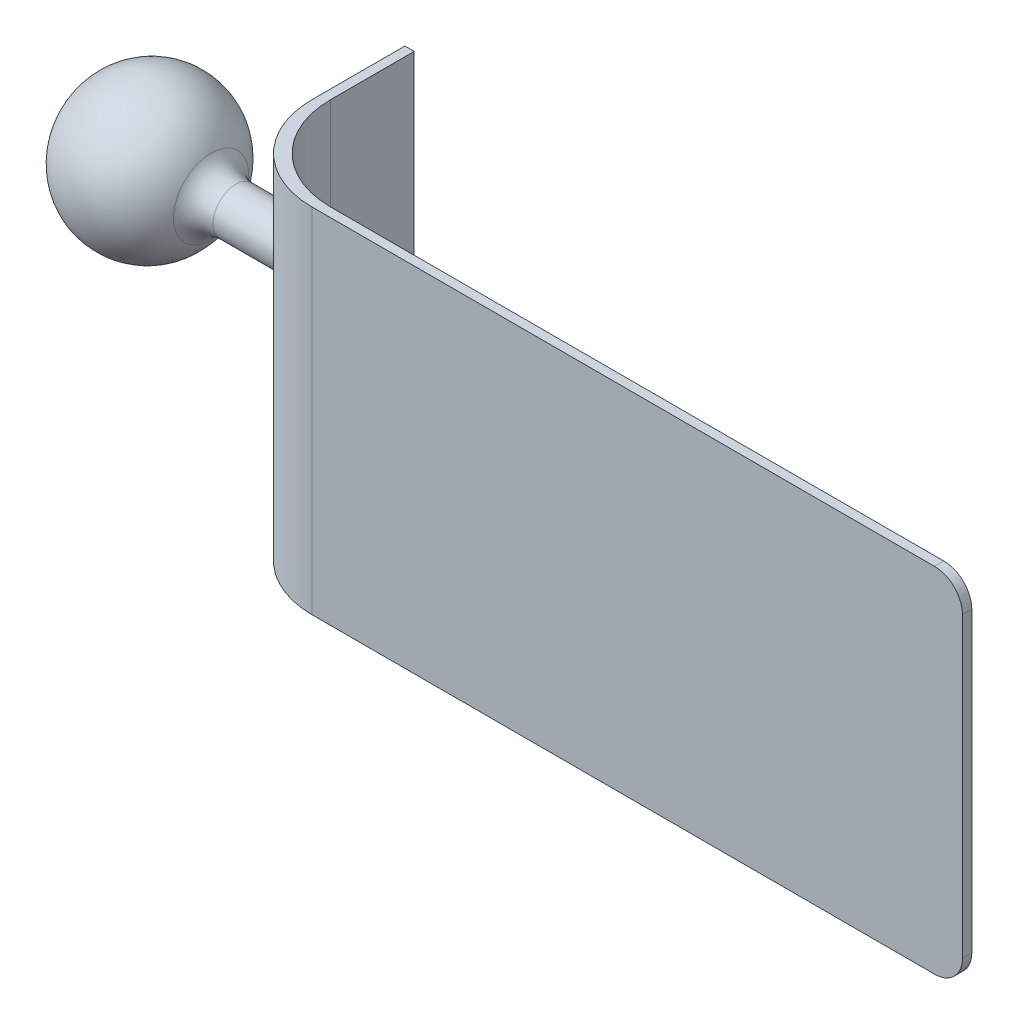
ISO-10303-21;
HEADER;
FILE_DESCRIPTION(('STEP AP214'),'2;1');
FILE_NAME('part.step','',(''),(''),'','','');
FILE_SCHEMA(('AUTOMOTIVE_DESIGN { 1 0 10303 214 1 1 1 1 }'));
ENDSEC;
DATA;
#1=APPLICATION_CONTEXT('core data for automotive mechanical design processes');
#2=APPLICATION_PROTOCOL_DEFINITION('international standard','automotive_design',2000,#1);
#3=PRODUCT_CONTEXT('',#1,'mechanical');
#4=PRODUCT('Part','Part','',(#3));
#5=PRODUCT_RELATED_PRODUCT_CATEGORY('part','',(#4));
#6=PRODUCT_DEFINITION_FORMATION('','',#4);
#7=PRODUCT_DEFINITION_CONTEXT('part definition',#1,'design');
#8=PRODUCT_DEFINITION('design','',#6,#7);
#9=PRODUCT_DEFINITION_SHAPE('','',#8);
#10=(LENGTH_UNIT() NAMED_UNIT(*) SI_UNIT(.MILLI.,.METRE.));
#11=(NAMED_UNIT(*) PLANE_ANGLE_UNIT() SI_UNIT($,.RADIAN.));
#12=(NAMED_UNIT(*) SI_UNIT($,.STERADIAN.) SOLID_ANGLE_UNIT());
#13=UNCERTAINTY_MEASURE_WITH_UNIT(LENGTH_MEASURE(1.E-05),#10,'distance_accuracy_value','');
#14=(GEOMETRIC_REPRESENTATION_CONTEXT(3) GLOBAL_UNCERTAINTY_ASSIGNED_CONTEXT((#13)) GLOBAL_UNIT_ASSIGNED_CONTEXT((#10,
#11,#12)) REPRESENTATION_CONTEXT('',''));
#15=CARTESIAN_POINT('',(0.,0.,0.));
#16=DIRECTION('',(0.,0.,1.));
#17=DIRECTION('',(1.,0.,0.));
#18=AXIS2_PLACEMENT_3D('',#15,#16,#17);
#19=CARTESIAN_POINT('',(-0.999999999999997,19.,20.));
#20=DIRECTION('',(1.,0.,0.));
#21=DIRECTION('',(0.,0.,-1.));
#22=AXIS2_PLACEMENT_3D('',#19,#20,#21);
#23=PLANE('',#22);
#24=DIRECTION('',(0.,-1.,0.));
#25=VECTOR('',#24,1.);
#26=CARTESIAN_POINT('',(-0.999999999999998,19.,10.));
#27=LINE('',#26,#25);
#28=CARTESIAN_POINT('',(-0.999999999999998,-19.,10.));
#29=VERTEX_POINT('',#28);
#30=CARTESIAN_POINT('',(-0.999999999999998,-3.01628226172121,10.));
#31=VERTEX_POINT('',#30);
#32=EDGE_CURVE('E281',#29,#31,#27,.F.);
#33=ORIENTED_EDGE('',*,*,#32,.T.);
#34=CARTESIAN_POINT('',(-0.999999999999999,0.,5.4548979341187));
#35=DIRECTION('',(1.,0.,0.));
#36=DIRECTION('',(0.,0.,-1.));
#37=AXIS2_PLACEMENT_3D('',#34,#35,#36);
#38=CIRCLE('',#37,5.4548979341187);
#39=CARTESIAN_POINT('',(-1.,0.,0.));
#40=VERTEX_POINT('',#39);
#41=EDGE_CURVE('E11',#31,#40,#38,.T.);
#42=ORIENTED_EDGE('',*,*,#41,.T.);
#43=DIRECTION('',(0.,-1.,0.));
#44=VECTOR('',#43,1.);
#45=CARTESIAN_POINT('',(-1.,19.,0.));
#46=LINE('',#45,#44);
#47=CARTESIAN_POINT('',(-1.,-19.,0.));
#48=VERTEX_POINT('',#47);
#49=EDGE_CURVE('E185',#40,#48,#46,.T.);
#50=ORIENTED_EDGE('',*,*,#49,.T.);
#51=DIRECTION('',(0.,0.,1.));
#52=VECTOR('',#51,1.);
#53=CARTESIAN_POINT('',(-0.999999999999997,-19.,20.));
#54=LINE('',#53,#52);
#55=EDGE_CURVE('E216',#48,#29,#54,.T.);
#56=ORIENTED_EDGE('',*,*,#55,.T.);
#57=EDGE_LOOP('',(#33,#42,#50,#56));
#58=FACE_BOUND('',#57,.T.);
#59=ADVANCED_FACE('F40',(#58),#23,.F.);
#60=CARTESIAN_POINT('',(-1.,19.,0.));
#61=DIRECTION('',(0.,0.,1.));
#62=DIRECTION('',(1.,0.,0.));
#63=AXIS2_PLACEMENT_3D('',#60,#61,#62);
#64=PLANE('',#63);
#65=DIRECTION('',(-1.,0.,0.));
#66=VECTOR('',#65,1.);
#67=CARTESIAN_POINT('',(-1.,-19.,0.));
#68=LINE('',#67,#66);
#69=CARTESIAN_POINT('',(0.,-19.,0.));
#70=VERTEX_POINT('',#69);
#71=EDGE_CURVE('E211',#70,#48,#68,.T.);
#72=ORIENTED_EDGE('',*,*,#71,.T.);
#73=ORIENTED_EDGE('',*,*,#49,.F.);
#74=CARTESIAN_POINT('',(-1.,19.,0.));
#75=VERTEX_POINT('',#74);
#76=EDGE_CURVE('E178',#75,#40,#46,.T.);
#77=ORIENTED_EDGE('',*,*,#76,.F.);
#78=DIRECTION('',(-1.,0.,0.));
#79=VECTOR('',#78,1.);
#80=CARTESIAN_POINT('',(-1.,19.,0.));
#81=LINE('',#80,#79);
#82=CARTESIAN_POINT('',(0.,19.,0.));
#83=VERTEX_POINT('',#82);
#84=EDGE_CURVE('E237',#83,#75,#81,.T.);
#85=ORIENTED_EDGE('',*,*,#84,.F.);
#86=DIRECTION('',(0.,-1.,0.));
#87=VECTOR('',#86,1.);
#88=CARTESIAN_POINT('',(0.,19.,0.));
#89=LINE('',#88,#87);
#90=EDGE_CURVE('E238',#83,#70,#89,.T.);
#91=ORIENTED_EDGE('',*,*,#90,.T.);
#92=EDGE_LOOP('',(#72,#73,#77,#85,#91));
#93=FACE_BOUND('',#92,.T.);
#94=ADVANCED_FACE('F159',(#93),#64,.F.);
#95=ORIENTED_EDGE('',*,*,#76,.T.);
#96=CARTESIAN_POINT('',(-0.999999999999999,0.,5.4548979341187));
#97=DIRECTION('',(1.,0.,0.));
#98=DIRECTION('',(0.,0.,-1.));
#99=AXIS2_PLACEMENT_3D('',#96,#97,#98);
#100=CIRCLE('',#99,5.4548979341187);
#101=CARTESIAN_POINT('',(-0.999999999999998,3.01628226172121,10.));
#102=VERTEX_POINT('',#101);
#103=EDGE_CURVE('E55',#40,#102,#100,.T.);
#104=ORIENTED_EDGE('',*,*,#103,.T.);
#105=CARTESIAN_POINT('',(-0.999999999999998,19.,10.));
#106=VERTEX_POINT('',#105);
#107=EDGE_CURVE('E280',#102,#106,#27,.F.);
#108=ORIENTED_EDGE('',*,*,#107,.T.);
#109=DIRECTION('',(0.,0.,1.));
#110=VECTOR('',#109,1.);
#111=CARTESIAN_POINT('',(-0.999999999999997,19.,20.));
#112=LINE('',#111,#110);
#113=EDGE_CURVE('E180',#75,#106,#112,.T.);
#114=ORIENTED_EDGE('',*,*,#113,.F.);
#115=EDGE_LOOP('',(#95,#104,#108,#114));
#116=FACE_BOUND('',#115,.T.);
#117=ADVANCED_FACE('F161',(#116),#23,.F.);
#118=CARTESIAN_POINT('',(79.,19.,20.));
#119=DIRECTION('',(0.,0.,-1.));
#120=DIRECTION('',(-1.,0.,0.));
#121=AXIS2_PLACEMENT_3D('',#118,#119,#120);
#122=PLANE('',#121);
#123=DIRECTION('',(1.,0.,0.));
#124=VECTOR('',#123,1.);
#125=CARTESIAN_POINT('',(79.,19.,20.));
#126=LINE('',#125,#124);
#127=CARTESIAN_POINT('',(9.00000000000001,19.,20.));
#128=VERTEX_POINT('',#127);
#129=CARTESIAN_POINT('',(76.,19.,20.));
#130=VERTEX_POINT('',#129);
#131=EDGE_CURVE('E351',#128,#130,#126,.T.);
#132=ORIENTED_EDGE('',*,*,#131,.F.);
#133=DIRECTION('',(0.,-1.,0.));
#134=VECTOR('',#133,1.);
#135=CARTESIAN_POINT('',(9.00000000000001,19.,20.));
#136=LINE('',#135,#134);
#137=CARTESIAN_POINT('',(9.00000000000001,-19.,20.));
#138=VERTEX_POINT('',#137);
#139=EDGE_CURVE('E276',#128,#138,#136,.T.);
#140=ORIENTED_EDGE('',*,*,#139,.T.);
#141=DIRECTION('',(1.,0.,0.));
#142=VECTOR('',#141,1.);
#143=CARTESIAN_POINT('',(79.,-19.,20.));
#144=LINE('',#143,#142);
#145=CARTESIAN_POINT('',(76.,-19.,20.));
#146=VERTEX_POINT('',#145);
#147=EDGE_CURVE('E222',#138,#146,#144,.T.);
#148=ORIENTED_EDGE('',*,*,#147,.T.);
#149=CARTESIAN_POINT('',(76.,-16.,20.));
#150=DIRECTION('',(0.,0.,-1.));
#151=DIRECTION('',(-1.,0.,0.));
#152=AXIS2_PLACEMENT_3D('',#149,#150,#151);
#153=CIRCLE('',#152,3.);
#154=CARTESIAN_POINT('',(79.,-16.,20.));
#155=VERTEX_POINT('',#154);
#156=EDGE_CURVE('E269',#146,#155,#153,.F.);
#157=ORIENTED_EDGE('',*,*,#156,.T.);
#158=DIRECTION('',(0.,-1.,0.));
#159=VECTOR('',#158,1.);
#160=CARTESIAN_POINT('',(79.,19.,20.));
#161=LINE('',#160,#159);
#162=CARTESIAN_POINT('',(79.,16.,20.));
#163=VERTEX_POINT('',#162);
#164=EDGE_CURVE('E245',#163,#155,#161,.T.);
#165=ORIENTED_EDGE('',*,*,#164,.F.);
#166=CARTESIAN_POINT('',(76.,16.,20.));
#167=DIRECTION('',(0.,0.,-1.));
#168=DIRECTION('',(-1.,0.,0.));
#169=AXIS2_PLACEMENT_3D('',#166,#167,#168);
#170=CIRCLE('',#169,3.);
#171=EDGE_CURVE('E265',#163,#130,#170,.F.);
#172=ORIENTED_EDGE('',*,*,#171,.T.);
#173=EDGE_LOOP('',(#132,#140,#148,#157,#165,#172));
#174=FACE_BOUND('',#173,.T.);
#175=ADVANCED_FACE('F170',(#174),#122,.F.);
#176=CARTESIAN_POINT('',(79.,19.,19.));
#177=DIRECTION('',(-1.,0.,0.));
#178=DIRECTION('',(0.,0.,1.));
#179=AXIS2_PLACEMENT_3D('',#176,#177,#178);
#180=PLANE('',#179);
#181=ORIENTED_EDGE('',*,*,#164,.T.);
#182=DIRECTION('',(0.,0.,-1.));
#183=VECTOR('',#182,1.);
#184=CARTESIAN_POINT('',(79.,-16.,19.));
#185=LINE('',#184,#183);
#186=CARTESIAN_POINT('',(79.,-16.,19.));
#187=VERTEX_POINT('',#186);
#188=EDGE_CURVE('E251',#155,#187,#185,.T.);
#189=ORIENTED_EDGE('',*,*,#188,.T.);
#190=DIRECTION('',(0.,-1.,0.));
#191=VECTOR('',#190,1.);
#192=CARTESIAN_POINT('',(79.,19.,19.));
#193=LINE('',#192,#191);
#194=CARTESIAN_POINT('',(79.,16.,19.));
#195=VERTEX_POINT('',#194);
#196=EDGE_CURVE('E241',#195,#187,#193,.T.);
#197=ORIENTED_EDGE('',*,*,#196,.F.);
#198=DIRECTION('',(0.,0.,-1.));
#199=VECTOR('',#198,1.);
#200=CARTESIAN_POINT('',(79.,16.,19.));
#201=LINE('',#200,#199);
#202=EDGE_CURVE('E184',#195,#163,#201,.F.);
#203=ORIENTED_EDGE('',*,*,#202,.T.);
#204=EDGE_LOOP('',(#181,#189,#197,#203));
#205=FACE_BOUND('',#204,.T.);
#206=ADVANCED_FACE('F175',(#205),#180,.F.);
#207=CARTESIAN_POINT('',(0.,19.,19.));
#208=DIRECTION('',(0.,0.,1.));
#209=DIRECTION('',(1.,0.,0.));
#210=AXIS2_PLACEMENT_3D('',#207,#208,#209);
#211=PLANE('',#210);
#212=DIRECTION('',(-1.,0.,0.));
#213=VECTOR('',#212,1.);
#214=CARTESIAN_POINT('',(0.,-19.,19.));
#215=LINE('',#214,#213);
#216=CARTESIAN_POINT('',(76.,-19.,19.));
#217=VERTEX_POINT('',#216);
#218=CARTESIAN_POINT('',(10.,-19.,19.));
#219=VERTEX_POINT('',#218);
#220=EDGE_CURVE('E230',#217,#219,#215,.T.);
#221=ORIENTED_EDGE('',*,*,#220,.T.);
#222=DIRECTION('',(0.,-1.,0.));
#223=VECTOR('',#222,1.);
#224=CARTESIAN_POINT('',(10.,19.,19.));
#225=LINE('',#224,#223);
#226=CARTESIAN_POINT('',(10.,19.,19.));
#227=VERTEX_POINT('',#226);
#228=EDGE_CURVE('E288',#219,#227,#225,.F.);
#229=ORIENTED_EDGE('',*,*,#228,.T.);
#230=DIRECTION('',(-1.,0.,0.));
#231=VECTOR('',#230,1.);
#232=CARTESIAN_POINT('',(0.,19.,19.));
#233=LINE('',#232,#231);
#234=CARTESIAN_POINT('',(76.,19.,19.));
#235=VERTEX_POINT('',#234);
#236=EDGE_CURVE('E345',#235,#227,#233,.T.);
#237=ORIENTED_EDGE('',*,*,#236,.F.);
#238=CARTESIAN_POINT('',(76.,16.,19.));
#239=DIRECTION('',(0.,0.,1.));
#240=DIRECTION('',(1.,0.,0.));
#241=AXIS2_PLACEMENT_3D('',#238,#239,#240);
#242=CIRCLE('',#241,3.);
#243=EDGE_CURVE('E255',#235,#195,#242,.F.);
#244=ORIENTED_EDGE('',*,*,#243,.T.);
#245=ORIENTED_EDGE('',*,*,#196,.T.);
#246=CARTESIAN_POINT('',(76.,-16.,19.));
#247=DIRECTION('',(0.,0.,1.));
#248=DIRECTION('',(1.,0.,0.));
#249=AXIS2_PLACEMENT_3D('',#246,#247,#248);
#250=CIRCLE('',#249,3.);
#251=EDGE_CURVE('E258',#187,#217,#250,.F.);
#252=ORIENTED_EDGE('',*,*,#251,.T.);
#253=EDGE_LOOP('',(#221,#229,#237,#244,#245,#252));
#254=FACE_BOUND('',#253,.T.);
#255=ADVANCED_FACE('F383',(#254),#211,.F.);
#256=CARTESIAN_POINT('',(0.,19.,0.));
#257=DIRECTION('',(-1.,0.,0.));
#258=DIRECTION('',(0.,0.,1.));
#259=AXIS2_PLACEMENT_3D('',#256,#257,#258);
#260=PLANE('',#259);
#261=DIRECTION('',(0.,0.,-1.));
#262=VECTOR('',#261,1.);
#263=CARTESIAN_POINT('',(0.,19.,0.));
#264=LINE('',#263,#262);
#265=CARTESIAN_POINT('',(0.,19.,9.));
#266=VERTEX_POINT('',#265);
#267=EDGE_CURVE('E225',#266,#83,#264,.T.);
#268=ORIENTED_EDGE('',*,*,#267,.F.);
#269=DIRECTION('',(0.,-1.,0.));
#270=VECTOR('',#269,1.);
#271=CARTESIAN_POINT('',(0.,-19.,9.));
#272=LINE('',#271,#270);
#273=CARTESIAN_POINT('',(0.,-19.,9.));
#274=VERTEX_POINT('',#273);
#275=EDGE_CURVE('E284',#266,#274,#272,.T.);
#276=ORIENTED_EDGE('',*,*,#275,.T.);
#277=DIRECTION('',(0.,0.,-1.));
#278=VECTOR('',#277,1.);
#279=CARTESIAN_POINT('',(0.,-19.,0.));
#280=LINE('',#279,#278);
#281=EDGE_CURVE('E234',#274,#70,#280,.T.);
#282=ORIENTED_EDGE('',*,*,#281,.T.);
#283=ORIENTED_EDGE('',*,*,#90,.F.);
#284=EDGE_LOOP('',(#268,#276,#282,#283));
#285=FACE_BOUND('',#284,.T.);
#286=ADVANCED_FACE('F347',(#285),#260,.F.);
#287=CARTESIAN_POINT('',(0.,19.,0.));
#288=DIRECTION('',(0.,-1.,0.));
#289=DIRECTION('',(0.,0.,-1.));
#290=AXIS2_PLACEMENT_3D('',#287,#288,#289);
#291=PLANE('',#290);
#292=ORIENTED_EDGE('',*,*,#113,.T.);
#293=CARTESIAN_POINT('',(9.00000000000001,19.,10.));
#294=DIRECTION('',(0.,-1.,0.));
#295=DIRECTION('',(0.,0.,-1.));
#296=AXIS2_PLACEMENT_3D('',#293,#294,#295);
#297=CIRCLE('',#296,10.);
#298=EDGE_CURVE('E300',#106,#128,#297,.F.);
#299=ORIENTED_EDGE('',*,*,#298,.T.);
#300=ORIENTED_EDGE('',*,*,#131,.T.);
#301=DIRECTION('',(0.,0.,-1.));
#302=VECTOR('',#301,1.);
#303=CARTESIAN_POINT('',(76.,19.,0.));
#304=LINE('',#303,#302);
#305=EDGE_CURVE('E272',#130,#235,#304,.T.);
#306=ORIENTED_EDGE('',*,*,#305,.T.);
#307=ORIENTED_EDGE('',*,*,#236,.T.);
#308=CARTESIAN_POINT('',(10.,19.,9.));
#309=DIRECTION('',(0.,-1.,0.));
#310=DIRECTION('',(0.,0.,-1.));
#311=AXIS2_PLACEMENT_3D('',#308,#309,#310);
#312=CIRCLE('',#311,10.);
#313=EDGE_CURVE('E294',#227,#266,#312,.T.);
#314=ORIENTED_EDGE('',*,*,#313,.T.);
#315=ORIENTED_EDGE('',*,*,#267,.T.);
#316=ORIENTED_EDGE('',*,*,#84,.T.);
#317=EDGE_LOOP('',(#292,#299,#300,#306,#307,#314,#315,#316));
#318=FACE_BOUND('',#317,.T.);
#319=ADVANCED_FACE('F342',(#318),#291,.F.);
#320=CARTESIAN_POINT('',(0.,-19.,0.));
#321=DIRECTION('',(0.,-1.,0.));
#322=DIRECTION('',(0.,0.,-1.));
#323=AXIS2_PLACEMENT_3D('',#320,#321,#322);
#324=PLANE('',#323);
#325=ORIENTED_EDGE('',*,*,#147,.F.);
#326=CARTESIAN_POINT('',(9.00000000000001,-19.,10.));
#327=DIRECTION('',(0.,-1.,0.));
#328=DIRECTION('',(0.,0.,-1.));
#329=AXIS2_PLACEMENT_3D('',#326,#327,#328);
#330=CIRCLE('',#329,10.);
#331=EDGE_CURVE('E297',#138,#29,#330,.T.);
#332=ORIENTED_EDGE('',*,*,#331,.T.);
#333=ORIENTED_EDGE('',*,*,#55,.F.);
#334=ORIENTED_EDGE('',*,*,#71,.F.);
#335=ORIENTED_EDGE('',*,*,#281,.F.);
#336=CARTESIAN_POINT('',(10.,-19.,9.));
#337=DIRECTION('',(0.,-1.,0.));
#338=DIRECTION('',(0.,0.,-1.));
#339=AXIS2_PLACEMENT_3D('',#336,#337,#338);
#340=CIRCLE('',#339,10.);
#341=EDGE_CURVE('E291',#274,#219,#340,.F.);
#342=ORIENTED_EDGE('',*,*,#341,.T.);
#343=ORIENTED_EDGE('',*,*,#220,.F.);
#344=DIRECTION('',(0.,0.,-1.));
#345=VECTOR('',#344,1.);
#346=CARTESIAN_POINT('',(76.,-19.,20.));
#347=LINE('',#346,#345);
#348=EDGE_CURVE('E261',#217,#146,#347,.F.);
#349=ORIENTED_EDGE('',*,*,#348,.T.);
#350=EDGE_LOOP('',(#325,#332,#333,#334,#335,#342,#343,#349));
#351=FACE_BOUND('',#350,.T.);
#352=ADVANCED_FACE('F362',(#351),#324,.T.);
#353=CARTESIAN_POINT('',(76.,-16.,19.));
#354=DIRECTION('',(0.,0.,1.));
#355=DIRECTION('',(1.,0.,0.));
#356=AXIS2_PLACEMENT_3D('',#353,#354,#355);
#357=CYLINDRICAL_SURFACE('',#356,3.);
#358=ORIENTED_EDGE('',*,*,#156,.F.);
#359=ORIENTED_EDGE('',*,*,#348,.F.);
#360=ORIENTED_EDGE('',*,*,#251,.F.);
#361=ORIENTED_EDGE('',*,*,#188,.F.);
#362=EDGE_LOOP('',(#358,#359,#360,#361));
#363=FACE_BOUND('',#362,.T.);
#364=ADVANCED_FACE('F389',(#363),#357,.T.);
#365=CARTESIAN_POINT('',(76.,16.,0.));
#366=DIRECTION('',(0.,0.,-1.));
#367=DIRECTION('',(-1.,0.,0.));
#368=AXIS2_PLACEMENT_3D('',#365,#366,#367);
#369=CYLINDRICAL_SURFACE('',#368,3.);
#370=ORIENTED_EDGE('',*,*,#171,.F.);
#371=ORIENTED_EDGE('',*,*,#202,.F.);
#372=ORIENTED_EDGE('',*,*,#243,.F.);
#373=ORIENTED_EDGE('',*,*,#305,.F.);
#374=EDGE_LOOP('',(#370,#371,#372,#373));
#375=FACE_BOUND('',#374,.T.);
#376=ADVANCED_FACE('F327',(#375),#369,.T.);
#377=CARTESIAN_POINT('',(9.00000000000001,19.,10.));
#378=DIRECTION('',(0.,-1.,0.));
#379=DIRECTION('',(0.,0.,-1.));
#380=AXIS2_PLACEMENT_3D('',#377,#378,#379);
#381=CYLINDRICAL_SURFACE('',#380,10.);
#382=ORIENTED_EDGE('',*,*,#107,.F.);
#383=CARTESIAN_POINT('',(-3.94390376285153,-1.94136244383158,6.9574410212282));
#384=CARTESIAN_POINT('',(-0.776973043843787,-1.79849788888066,7.14202932615993));
#385=CARTESIAN_POINT('',(-0.956849048347329,-4.31379807569649,9.07201453221253));
#386=CARTESIAN_POINT('',(-3.95482744857737,-1.90055215566379,7.01017326044168));
#387=CARTESIAN_POINT('',(-0.79700951103472,-1.77015969698514,7.16826371210844));
#388=CARTESIAN_POINT('',(-0.965251883319375,-4.22311570820443,9.16214799365908));
#389=CARTESIAN_POINT('',(-3.96379970036924,-1.85757101755895,7.06126259084152));
#390=CARTESIAN_POINT('',(-0.817093531545748,-1.74029117807563,7.19588904469838));
#391=CARTESIAN_POINT('',(-0.972153615439907,-4.12760961070211,9.2494732857387));
#392=CARTESIAN_POINT('',(-3.97842151181198,-1.76755246532053,7.15981327177734));
#393=CARTESIAN_POINT('',(-0.856690819255853,-1.67653674041648,7.25325292692665));
#394=CARTESIAN_POINT('',(-0.983401162777323,-3.92758418080006,9.41792268465591));
#395=CARTESIAN_POINT('',(-3.98407194281841,-1.72051611863481,7.20727557088492));
#396=CARTESIAN_POINT('',(-0.876193037670314,-1.64269223762971,7.28296139852963));
#397=CARTESIAN_POINT('',(-0.987747648267693,-3.82306722031938,9.49904841285537));
#398=CARTESIAN_POINT('',(-3.99690046545312,-1.5739088527389,7.34357208105838));
#399=CARTESIAN_POINT('',(-0.932776025030133,-1.5340487200994,7.37403871960685));
#400=CARTESIAN_POINT('',(-0.997615742764353,-3.49729902411551,9.73201550141151));
#401=CARTESIAN_POINT('',(-3.99999377167389,-1.46867861303107,7.42652379494158));
#402=CARTESIAN_POINT('',(-0.968289865527426,-1.45173073597506,7.43780471999368));
#403=CARTESIAN_POINT('',(-0.999995209010274,-3.26347251377016,9.8738021051267));
#404=CARTESIAN_POINT('',(-4.00000643694355,-1.24246369103073,7.57665997839058));
#405=CARTESIAN_POINT('',(-1.03242385643974,-1.2610152961194,7.56431393923753));
#406=CARTESIAN_POINT('',(-1.00000495146366,-2.7608123854054,10.1304248866101));
#407=CARTESIAN_POINT('',(-3.99671552954661,-1.1210693735366,7.64322326047474));
#408=CARTESIAN_POINT('',(-1.06089185279615,-1.1520099374931,7.62704330146566));
#409=CARTESIAN_POINT('',(-0.997473484254474,-2.49106853882458,10.2441992892902));
#410=CARTESIAN_POINT('',(-3.98827305764959,-0.868839815078271,7.75504193362535));
#411=CARTESIAN_POINT('',(-1.1079893268894,-0.912261722465412,7.73823158887988));
#412=CARTESIAN_POINT('',(-0.990979275127215,-1.93060267251069,10.4353272257142));
#413=CARTESIAN_POINT('',(-3.98312153096771,-0.73800476604584,7.80029775773558));
#414=CARTESIAN_POINT('',(-1.12676538311092,-0.781430913561587,7.78695447628727));
#415=CARTESIAN_POINT('',(-0.987016562300061,-1.63988107925897,10.5126814996453));
#416=CARTESIAN_POINT('',(-3.9744999437901,-0.470613394511348,7.86820986989585));
#417=CARTESIAN_POINT('',(-1.15453748243161,-0.505444476182555,7.86166335095075));
#418=CARTESIAN_POINT('',(-0.980384572129025,-1.04572495573432,10.6287614126823));
#419=CARTESIAN_POINT('',(-3.97102955682755,-0.334058188428607,7.89087054668772));
#420=CARTESIAN_POINT('',(-1.1636454278348,-0.359872568085121,7.8879280768077));
#421=CARTESIAN_POINT('',(-0.977715043656816,-0.74229290619728,10.6674945533185));
#422=CARTESIAN_POINT('',(-3.96765389667738,-0.0590134367533881,7.91296150482361));
#423=CARTESIAN_POINT('',(-1.17248853885858,-0.0642619112654179,7.91340733517793));
#424=CARTESIAN_POINT('',(-0.975118382007244,-0.131130614335253,10.7052538928204));
#425=CARTESIAN_POINT('',(-3.96774995819922,0.0794768136288046,7.91238308915151));
#426=CARTESIAN_POINT('',(-1.17225849835539,0.0864075877024398,7.91272219281264));
#427=CARTESIAN_POINT('',(-0.975192275529483,0.176601194065421,10.7042652261659));
#428=CARTESIAN_POINT('',(-3.97145772693501,0.354263109727421,7.88801244957545));
#429=CARTESIAN_POINT('',(-1.16249792942784,0.381449809972744,7.88464535887838));
#430=CARTESIAN_POINT('',(-0.978044405342992,0.787189185557863,10.6626093030533));
#431=CARTESIAN_POINT('',(-3.97506681191779,0.490560714969222,7.8642375402326));
#432=CARTESIAN_POINT('',(-1.15293223822152,0.526449209029081,7.85715259063931));
#433=CARTESIAN_POINT('',(-0.980820624533416,1.0900488339879,10.6219716417982));
#434=CARTESIAN_POINT('',(-3.98382631343559,0.757102437760409,7.79418257559173));
#435=CARTESIAN_POINT('',(-1.12423850996761,0.80068762954161,7.78037165950904));
#436=CARTESIAN_POINT('',(-0.987558702661451,1.68231699829839,10.5022290223339));
#437=CARTESIAN_POINT('',(-3.98897450288397,0.887354990016902,7.74793497824585));
#438=CARTESIAN_POINT('',(-1.10501146627289,0.930354353352522,7.73083691909585));
#439=CARTESIAN_POINT('',(-0.991518848455367,1.97174425649221,10.423179543422));
#440=CARTESIAN_POINT('',(-3.99504711963027,1.07262620180457,7.66404769499179));
#441=CARTESIAN_POINT('',(-1.06973557298574,1.10524085595378,7.64813528702882));
#442=CARTESIAN_POINT('',(-0.99619009198356,2.38342554734595,10.2797938021226));
#443=CARTESIAN_POINT('',(-3.99677368424664,1.13143222455706,7.63451183253012));
#444=CARTESIAN_POINT('',(-1.05720014374595,1.15943129102429,7.61977973640352));
#445=CARTESIAN_POINT('',(-0.997518218538104,2.51409527807814,10.2293091354395));
#446=CARTESIAN_POINT('',(-3.99924988912132,1.24645606490214,7.57083321653496));
#447=CARTESIAN_POINT('',(-1.03008175935519,1.26250253421693,7.56117922519256));
#448=CARTESIAN_POINT('',(-0.999422991533793,2.7696836267229,10.1204653964949));
#449=CARTESIAN_POINT('',(-4.00000034026661,1.30267599333637,7.53669431294378));
#450=CARTESIAN_POINT('',(-1.01548576241434,1.31137925145618,7.53091647318983));
#451=CARTESIAN_POINT('',(-1.00000026173401,2.89460693502427,10.0621129048115));
#452=CARTESIAN_POINT('',(-3.99999965528495,1.41290830904978,7.46354140368325));
#453=CARTESIAN_POINT('',(-0.984229851540746,1.40433494749082,7.46923308016285));
#454=CARTESIAN_POINT('',(-0.999999734844232,3.13954829201546,9.93707507171746));
#455=CARTESIAN_POINT('',(-3.99922876012726,1.46688222769956,7.42446949888034));
#456=CARTESIAN_POINT('',(-0.967534640059443,1.44831622015157,7.43779680970662));
#457=CARTESIAN_POINT('',(-0.999406738497734,3.25948086161301,9.87029076524481));
#458=CARTESIAN_POINT('',(-3.99556347300196,1.57148945753756,7.3420598279726));
#459=CARTESIAN_POINT('',(-0.932551772975939,1.53096757246886,7.37528940611355));
#460=CARTESIAN_POINT('',(-0.996587286857122,3.49192301491301,9.7294306575513));
#461=CARTESIAN_POINT('',(-3.99266826741047,1.62212148065846,7.29872043290097));
#462=CARTESIAN_POINT('',(-0.914257462956258,1.56960170275223,7.34422466585435));
#463=CARTESIAN_POINT('',(-0.994360205698533,3.6044297364697,9.65535207199171));
#464=CARTESIAN_POINT('',(-3.98413449168721,1.71995387273232,7.20782784711557));
#465=CARTESIAN_POINT('',(-0.876417201446042,1.64226617435919,7.28332821719753));
#466=CARTESIAN_POINT('',(-0.987795762751373,3.82181788364958,9.49999240023815));
#467=CARTESIAN_POINT('',(-3.97848006888948,1.76713257764906,7.16025162154287));
#468=CARTESIAN_POINT('',(-0.856867096719597,1.67622754191769,7.25352548450686));
#469=CARTESIAN_POINT('',(-0.983446206603125,3.9266511707719,9.41867194132653));
#470=CARTESIAN_POINT('',(-3.96383763339299,1.85739657672663,7.06147478235989));
#471=CARTESIAN_POINT('',(-0.817178170489798,1.74018031347171,7.19599428340112));
#472=CARTESIAN_POINT('',(-0.972182794564462,4.1272219950202,9.24983597764672));
#473=CARTESIAN_POINT('',(-3.95485016252742,1.90048253479095,7.01027475894227));
#474=CARTESIAN_POINT('',(-0.797050664121099,1.77013176246906,7.1682951464315));
#475=CARTESIAN_POINT('',(-0.965269355468773,4.22296100737075,9.16232148167517));
#476=CARTESIAN_POINT('',(-3.94390376285153,1.94136244383158,6.9574410212282));
#477=CARTESIAN_POINT('',(-0.776973043843788,1.79849788888066,7.14202932615993));
#478=CARTESIAN_POINT('',(-0.95684904834733,4.31379807569649,9.07201453221253));
#479=(BOUNDED_SURFACE() B_SPLINE_SURFACE(3,2,((#383,#384,#385),(#386,#387,#388),(#389,#390,
#391),(#392,#393,#394),(#395,#396,#397),(#398,#399,#400),(#401,#402,#403),(#404,#405,#406),
(#407,#408,#409),(#410,#411,#412),(#413,#414,#415),(#416,#417,#418),(#419,#420,#421),(#422,#423,
#424),(#425,#426,#427),(#428,#429,#430),(#431,#432,#433),(#434,#435,#436),(#437,#438,#439),
(#440,#441,#442),(#443,#444,#445),(#446,#447,#448),(#449,#450,#451),(#452,#453,#454),(#455,#456,
#457),(#458,#459,#460),(#461,#462,#463),(#464,#465,#466),(#467,#468,#469),(#470,#471,#472),
(#473,#474,#475),(#476,#477,#478)),.UNSPECIFIED.,.F.,.F.,.F.) B_SPLINE_SURFACE_WITH_KNOTS((4,2,
2,2,2,2,2,2,2,2,2,2,2,2,2,4),(3,3),(0.,0.445417643601919,0.890718396333481,1.77958526860207,
2.69822468919992,3.61684543895253,4.53528772670856,5.45407373622412,6.37217446046869,
7.28895306914356,7.72727902341144,8.16524061400265,8.60892782782861,9.05278506533433,
9.4992229887367,9.9455883692544),(0.,1.),
.UNSPECIFIED.) GEOMETRIC_REPRESENTATION_ITEM() RATIONAL_B_SPLINE_SURFACE(((1.,0.68673203919925,
1.),(1.,0.688014212787868,1.),(1.,0.68946526199555,1.),(1.,0.692607854445996,1.),(1.,
0.694299334476021,1.),(1.,0.699582922223898,1.),(1.,0.703389926238829,1.),(1.,0.710948131991876,
1.),(1.,0.714693193514357,1.),(1.,0.721315650387559,1.),(1.,0.724193063371575,1.),(1.,
0.728608315407315,1.),(1.,0.73014641459172,1.),(1.,0.731645025244272,1.),(1.,0.731604946093839,
1.),(1.,0.729953480925001,1.),(1.,0.728343266903043,1.),(1.,0.723803318164037,1.),(1.,
0.720875486968603,1.),(1.,0.715937747719231,1.),(1.,0.714246224209618,1.),(1.,0.710745548260829,
1.),(1.,0.708936494770941,1.),(1.,0.70525314712411,1.),(1.,0.703378309242992,1.),(1.,
0.699674574207247,1.),(1.,0.697845694932706,1.),(1.,0.694319294192559,1.),(1.,0.69262259829648,
1.),(1.,0.689471265970867,1.),(1.,0.688016590253246,1.),(1.,0.68673203919925,1.))) REPRESENTATION_ITEM('') SURFACE());
#480=CARTESIAN_POINT('',(-0.95684904834733,4.31379807569649,9.07201453221253));
#481=CARTESIAN_POINT('',(-0.965269355468773,4.22296100737075,9.16232148167517));
#482=CARTESIAN_POINT('',(-0.972182794564462,4.12722199502019,9.24983597764672));
#483=CARTESIAN_POINT('',(-0.983446206603125,3.9266511707719,9.41867194132653));
#484=CARTESIAN_POINT('',(-0.987795762751373,3.82181788364958,9.49999240023815));
#485=CARTESIAN_POINT('',(-0.994360205698533,3.6044297364697,9.65535207199171));
#486=CARTESIAN_POINT('',(-0.996587286857122,3.49192301491301,9.7294306575513));
#487=CARTESIAN_POINT('',(-0.999406738497735,3.25948086161301,9.87029076524481));
#488=CARTESIAN_POINT('',(-0.999999734844232,3.13954829201546,9.93707507171746));
#489=CARTESIAN_POINT('',(-1.00000026173401,2.89460693502427,10.0621129048115));
#490=CARTESIAN_POINT('',(-0.999422991533793,2.7696836267229,10.1204653964949));
#491=CARTESIAN_POINT('',(-0.997518218538104,2.51409527807814,10.2293091354395));
#492=CARTESIAN_POINT('',(-0.99619009198356,2.38342554734595,10.2797938021226));
#493=CARTESIAN_POINT('',(-0.991518848455367,1.97174425649221,10.423179543422));
#494=CARTESIAN_POINT('',(-0.987558702661451,1.68231699829839,10.5022290223339));
#495=CARTESIAN_POINT('',(-0.980820624533416,1.0900488339879,10.6219716417982));
#496=CARTESIAN_POINT('',(-0.978044405342992,0.787189185557863,10.6626093030533));
#497=CARTESIAN_POINT('',(-0.975192275529483,0.176601194065421,10.7042652261659));
#498=CARTESIAN_POINT('',(-0.975118382007244,-0.131130614335253,10.7052538928204));
#499=CARTESIAN_POINT('',(-0.977715043656816,-0.74229290619728,10.6674945533185));
#500=CARTESIAN_POINT('',(-0.980384572129025,-1.04572495573432,10.6287614126823));
#501=CARTESIAN_POINT('',(-0.987016562300061,-1.63988107925897,10.5126814996453));
#502=CARTESIAN_POINT('',(-0.990979275127215,-1.93060267251069,10.4353272257142));
#503=CARTESIAN_POINT('',(-0.997473484254474,-2.49106853882458,10.2441992892902));
#504=CARTESIAN_POINT('',(-1.00000495146366,-2.7608123854054,10.1304248866101));
#505=CARTESIAN_POINT('',(-0.999995209010274,-3.26347251377016,9.8738021051267));
#506=CARTESIAN_POINT('',(-0.997615742764353,-3.49729902411551,9.73201550141151));
#507=CARTESIAN_POINT('',(-0.987747648267693,-3.82306722031938,9.49904841285537));
#508=CARTESIAN_POINT('',(-0.983401162777323,-3.92758418080006,9.41792268465591));
#509=CARTESIAN_POINT('',(-0.972153615439907,-4.12760961070211,9.2494732857387));
#510=CARTESIAN_POINT('',(-0.965251883319375,-4.22311570820443,9.16214799365908));
#511=CARTESIAN_POINT('',(-0.956849048347329,-4.31379807569649,9.07201453221253));
#512=B_SPLINE_CURVE_WITH_KNOTS('',3,(#480,#481,#482,#483,#484,#485,#486,#487,#488,#489,#490,
#491,#492,#493,#494,#495,#496,#497,#498,#499,#500,#501,#502,#503,#504,#505,#506,#507,#508,#509,
#510,#511),.UNSPECIFIED.,.F.,.F.,(4,2,2,2,2,2,2,2,2,2,2,2,2,2,2,4),(0.,0.446365380517705,
0.892803303920074,1.33666054142579,1.78034775525175,2.21830934584296,2.65663530011084,
3.57341390878571,4.49151463303028,5.41030064254584,6.32874293030187,7.24736368005448,
8.16600310065234,9.05486997292092,9.50017072565248,9.9455883692544),.UNSPECIFIED.);
#513=EDGE_CURVE('E195',#102,#31,#512,.T.);
#514=ORIENTED_EDGE('',*,*,#513,.T.);
#515=ORIENTED_EDGE('',*,*,#32,.F.);
#516=ORIENTED_EDGE('',*,*,#331,.F.);
#517=ORIENTED_EDGE('',*,*,#139,.F.);
#518=ORIENTED_EDGE('',*,*,#298,.F.);
#519=EDGE_LOOP('',(#382,#514,#515,#516,#517,#518));
#520=FACE_BOUND('',#519,.T.);
#521=ADVANCED_FACE('F324',(#520),#381,.T.);
#522=CARTESIAN_POINT('',(10.,19.,9.));
#523=DIRECTION('',(0.,1.,0.));
#524=DIRECTION('',(0.,0.,1.));
#525=AXIS2_PLACEMENT_3D('',#522,#523,#524);
#526=CYLINDRICAL_SURFACE('',#525,10.);
#527=ORIENTED_EDGE('',*,*,#313,.F.);
#528=ORIENTED_EDGE('',*,*,#228,.F.);
#529=ORIENTED_EDGE('',*,*,#341,.F.);
#530=ORIENTED_EDGE('',*,*,#275,.F.);
#531=EDGE_LOOP('',(#527,#528,#529,#530));
#532=FACE_BOUND('',#531,.T.);
#533=ADVANCED_FACE('F153',(#532),#526,.F.);
#534=CARTESIAN_POINT('',(-0.503131216799374,0.,5.4548979341187));
#535=DIRECTION('',(1.,0.,0.));
#536=DIRECTION('',(0.,0.,-1.));
#537=AXIS2_PLACEMENT_3D('',#534,#535,#536);
#538=CYLINDRICAL_SURFACE('',#537,2.4548979341187);
#539=CARTESIAN_POINT('',(-13.750020918463,0.,5.4548979341187));
#540=DIRECTION('',(1.,0.,0.));
#541=DIRECTION('',(0.,0.,-1.));
#542=AXIS2_PLACEMENT_3D('',#539,#540,#541);
#543=CIRCLE('',#542,2.4548979341187);
#544=CARTESIAN_POINT('',(-13.750020918463,0.,3.));
#545=VERTEX_POINT('',#544);
#546=EDGE_CURVE('E367',#545,#545,#543,.T.);
#547=ORIENTED_EDGE('',*,*,#546,.T.);
#548=EDGE_LOOP('',(#547));
#549=FACE_BOUND('',#548,.T.);
#550=CARTESIAN_POINT('',(-3.94390376285153,-1.94136244383158,6.9574410212282));
#551=CARTESIAN_POINT('',(-3.95482744857737,-1.90055215566379,7.01017326044168));
#552=CARTESIAN_POINT('',(-3.96379970036924,-1.85757101755895,7.06126259084152));
#553=CARTESIAN_POINT('',(-3.97842151181198,-1.76755246532053,7.15981327177734));
#554=CARTESIAN_POINT('',(-3.98407194281841,-1.72051611863481,7.20727557088492));
#555=CARTESIAN_POINT('',(-3.99690046545312,-1.5739088527389,7.34357208105838));
#556=CARTESIAN_POINT('',(-3.99999377167389,-1.46867861303107,7.42652379494158));
#557=CARTESIAN_POINT('',(-4.00000643694355,-1.24246369103073,7.57665997839058));
#558=CARTESIAN_POINT('',(-3.99671552954661,-1.1210693735366,7.64322326047474));
#559=CARTESIAN_POINT('',(-3.98827305764959,-0.868839815078271,7.75504193362535));
#560=CARTESIAN_POINT('',(-3.98312153096771,-0.73800476604584,7.80029775773558));
#561=CARTESIAN_POINT('',(-3.9744999437901,-0.470613394511348,7.86820986989585));
#562=CARTESIAN_POINT('',(-3.97102955682755,-0.334058188428607,7.89087054668772));
#563=CARTESIAN_POINT('',(-3.96765389667738,-0.059013436753388,7.91296150482361));
#564=CARTESIAN_POINT('',(-3.96774995819922,0.0794768136288046,7.91238308915151));
#565=CARTESIAN_POINT('',(-3.97145772693501,0.354263109727421,7.88801244957545));
#566=CARTESIAN_POINT('',(-3.97506681191779,0.490560714969222,7.8642375402326));
#567=CARTESIAN_POINT('',(-3.98382631343559,0.757102437760409,7.79418257559173));
#568=CARTESIAN_POINT('',(-3.98897450288398,0.887354990016902,7.74793497824585));
#569=CARTESIAN_POINT('',(-3.99504711963027,1.07262620180457,7.66404769499179));
#570=CARTESIAN_POINT('',(-3.99677368424664,1.13143222455706,7.63451183253012));
#571=CARTESIAN_POINT('',(-3.99924988912132,1.24645606490214,7.57083321653496));
#572=CARTESIAN_POINT('',(-4.00000034026661,1.30267599333637,7.53669431294378));
#573=CARTESIAN_POINT('',(-3.99999965528495,1.41290830904978,7.46354140368324));
#574=CARTESIAN_POINT('',(-3.99922876012726,1.46688222769956,7.42446949888033));
#575=CARTESIAN_POINT('',(-3.99556347300196,1.57148945753756,7.3420598279726));
#576=CARTESIAN_POINT('',(-3.99266826741047,1.62212148065846,7.29872043290097));
#577=CARTESIAN_POINT('',(-3.98413449168721,1.71995387273232,7.20782784711558));
#578=CARTESIAN_POINT('',(-3.97848006888948,1.76713257764906,7.16025162154287));
#579=CARTESIAN_POINT('',(-3.963837633393,1.85739657672663,7.06147478235989));
#580=CARTESIAN_POINT('',(-3.95485016252742,1.90048253479095,7.01027475894227));
#581=CARTESIAN_POINT('',(-3.94390376285153,1.94136244383158,6.9574410212282));
#582=B_SPLINE_CURVE_WITH_KNOTS('',3,(#550,#551,#552,#553,#554,#555,#556,#557,#558,#559,#560,
#561,#562,#563,#564,#565,#566,#567,#568,#569,#570,#571,#572,#573,#574,#575,#576,#577,#578,#579,
#580,#581),.UNSPECIFIED.,.F.,.F.,(4,2,2,2,2,2,2,2,2,2,2,2,2,2,2,4),(0.,0.445417643601919,
0.890718396333481,1.77958526860207,2.69822468919992,3.61684543895253,4.53528772670856,
5.45407373622412,6.37217446046869,7.28895306914356,7.72727902341144,8.16524061400265,
8.60892782782861,9.05278506533433,9.4992229887367,9.9455883692544),.UNSPECIFIED.);
#583=CARTESIAN_POINT('',(-3.99999999999999,-1.35743421461736,7.50035539393702));
#584=VERTEX_POINT('',#583);
#585=CARTESIAN_POINT('',(-4.,1.35743421461736,7.50035539393702));
#586=VERTEX_POINT('',#585);
#587=EDGE_CURVE('E303',#584,#586,#582,.T.);
#588=ORIENTED_EDGE('',*,*,#587,.T.);
#589=CARTESIAN_POINT('',(-4.,0.,5.4548979341187));
#590=DIRECTION('',(1.,0.,0.));
#591=DIRECTION('',(0.,0.,-1.));
#592=AXIS2_PLACEMENT_3D('',#589,#590,#591);
#593=CIRCLE('',#592,2.4548979341187);
#594=EDGE_CURVE('E312',#586,#584,#593,.F.);
#595=ORIENTED_EDGE('',*,*,#594,.T.);
#596=EDGE_LOOP('',(#588,#595));
#597=FACE_BOUND('',#596,.T.);
#598=ADVANCED_FACE('F143',(#549,#597),#538,.T.);
#599=CARTESIAN_POINT('',(-23.0216499856026,0.,4.92817354010304));
#600=DIRECTION('',(0.,-1.,0.));
#601=DIRECTION('',(0.,0.,-1.));
#602=AXIS2_PLACEMENT_3D('',#599,#600,#601);
#603=CIRCLE('',#602,7.5);
#604=TRIMMED_CURVE('',#603,(PARAMETER_VALUE(-1.64108410633166)),
(PARAMETER_VALUE(1.64108410633166)),.T.,.PARAMETER.);
#605=CARTESIAN_POINT('',(-23.0216499856026,0.,5.4548979341187));
#606=DIRECTION('',(1.,0.,0.));
#607=AXIS1_PLACEMENT('',#605,#606);
#608=SURFACE_OF_REVOLUTION('',#604,#607);
#609=CARTESIAN_POINT('',(-16.3990577947886,0.,5.4548979341187));
#610=DIRECTION('',(-1.,0.,0.));
#611=DIRECTION('',(0.,0.,1.));
#612=AXIS2_PLACEMENT_3D('',#609,#610,#611);
#613=CIRCLE('',#612,4.04684835123212);
#614=CARTESIAN_POINT('',(-16.3990577947886,0.,9.50174628535082));
#615=VERTEX_POINT('',#614);
#616=EDGE_CURVE('E198',#615,#615,#613,.T.);
#617=ORIENTED_EDGE('',*,*,#616,.T.);
#618=EDGE_LOOP('',(#617));
#619=FACE_BOUND('',#618,.T.);
#620=CARTESIAN_POINT('',(-30.5031312167994,0.,5.4548979341187));
#621=VERTEX_POINT('',#620);
#622=VERTEX_LOOP('',#621);
#623=FACE_BOUND('',#622,.T.);
#624=ADVANCED_FACE('F140',(#619,#623),#608,.T.);
#625=CARTESIAN_POINT('',(-13.750020918463,0.,5.4548979341187));
#626=DIRECTION('',(1.,0.,0.));
#627=DIRECTION('',(0.,0.,-1.));
#628=AXIS2_PLACEMENT_3D('',#625,#626,#627);
#629=TOROIDAL_SURFACE('',#628,5.4548979341187,3.);
#630=ORIENTED_EDGE('',*,*,#616,.F.);
#631=EDGE_LOOP('',(#630));
#632=FACE_BOUND('',#631,.T.);
#633=ORIENTED_EDGE('',*,*,#546,.F.);
#634=EDGE_LOOP('',(#633));
#635=FACE_BOUND('',#634,.T.);
#636=ADVANCED_FACE('F142',(#632,#635),#629,.F.);
#637=CARTESIAN_POINT('',(-4.,0.,5.4548979341187));
#638=DIRECTION('',(1.,0.,0.));
#639=DIRECTION('',(0.,0.,-1.));
#640=AXIS2_PLACEMENT_3D('',#637,#638,#639);
#641=TOROIDAL_SURFACE('',#640,5.4548979341187,3.);
#642=CARTESIAN_POINT('',(-4.,-3.01628226172122,10.));
#643=DIRECTION('',(0.,-0.833214868687659,-0.552949349034617));
#644=DIRECTION('',(0.,0.552949349034617,-0.833214868687659));
#645=AXIS2_PLACEMENT_3D('',#642,#643,#644);
#646=CIRCLE('',#645,3.);
#647=EDGE_CURVE('E208',#584,#31,#646,.T.);
#648=ORIENTED_EDGE('',*,*,#647,.F.);
#649=ORIENTED_EDGE('',*,*,#594,.F.);
#650=CARTESIAN_POINT('',(-4.,3.01628226172121,10.));
#651=DIRECTION('',(0.,0.833214868687659,-0.552949349034617));
#652=DIRECTION('',(0.,0.552949349034617,0.833214868687659));
#653=AXIS2_PLACEMENT_3D('',#650,#651,#652);
#654=CIRCLE('',#653,3.);
#655=EDGE_CURVE('E192',#102,#586,#654,.T.);
#656=ORIENTED_EDGE('',*,*,#655,.F.);
#657=ORIENTED_EDGE('',*,*,#103,.F.);
#658=ORIENTED_EDGE('',*,*,#41,.F.);
#659=EDGE_LOOP('',(#648,#649,#656,#657,#658));
#660=FACE_BOUND('',#659,.T.);
#661=ADVANCED_FACE('F42',(#660),#641,.F.);
#662=ORIENTED_EDGE('',*,*,#655,.T.);
#663=ORIENTED_EDGE('',*,*,#587,.F.);
#664=ORIENTED_EDGE('',*,*,#647,.T.);
#665=ORIENTED_EDGE('',*,*,#513,.F.);
#666=EDGE_LOOP('',(#662,#663,#664,#665));
#667=FACE_BOUND('',#666,.T.);
#668=ADVANCED_FACE('F319',(#667),#479,.F.);
#669=CLOSED_SHELL('',(#59,#94,#117,#175,#206,#255,#286,#319,#352,#364,#376,#521,#533,#598,#624,
#636,#661,#668));
#670=MANIFOLD_SOLID_BREP('B2',#669);
#671=ADVANCED_BREP_SHAPE_REPRESENTATION('',(#18,#670),#14);
#672=SHAPE_DEFINITION_REPRESENTATION(#9,#671);
ENDSEC;
END-ISO-10303-21;
